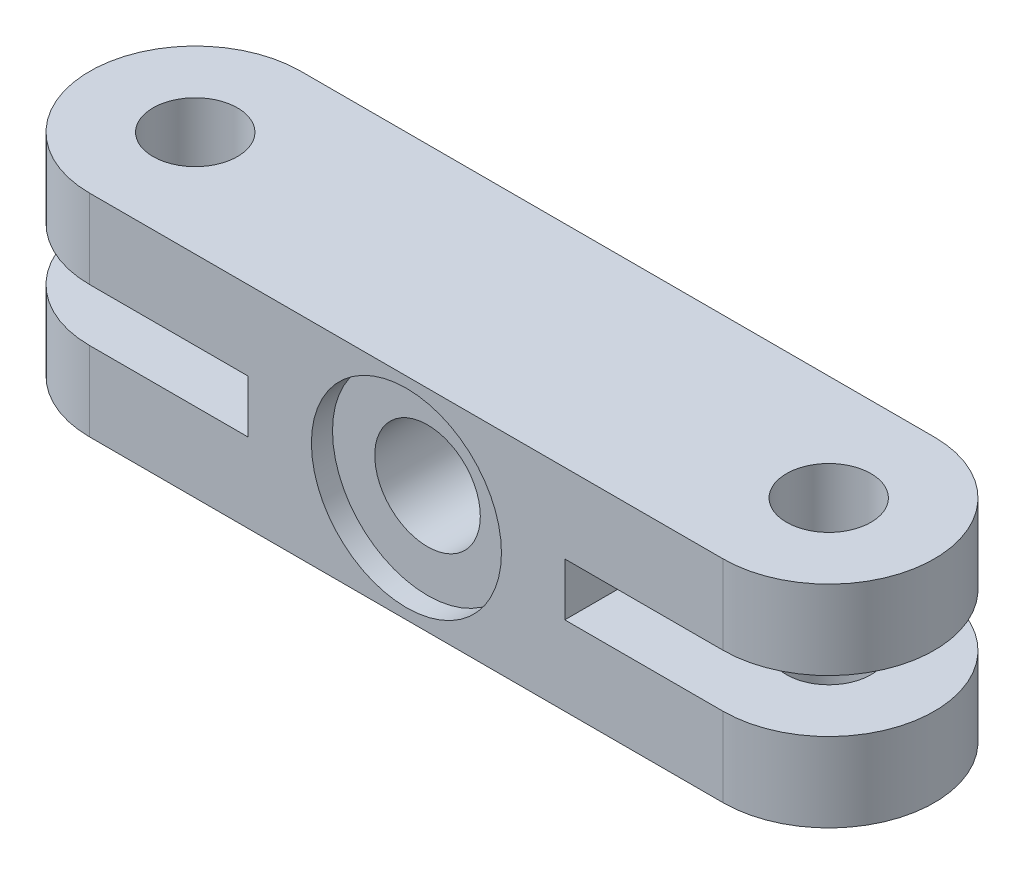
ISO-10303-21;
HEADER;
FILE_DESCRIPTION(('STEP AP214'),'2;1');
FILE_NAME('part.step','',(''),(''),'','','');
FILE_SCHEMA(('AUTOMOTIVE_DESIGN { 1 0 10303 214 1 1 1 1 }'));
ENDSEC;
DATA;
#1=APPLICATION_CONTEXT('core data for automotive mechanical design processes');
#2=APPLICATION_PROTOCOL_DEFINITION('international standard','automotive_design',2000,#1);
#3=PRODUCT_CONTEXT('',#1,'mechanical');
#4=PRODUCT('Part','Part','',(#3));
#5=PRODUCT_RELATED_PRODUCT_CATEGORY('part','',(#4));
#6=PRODUCT_DEFINITION_FORMATION('','',#4);
#7=PRODUCT_DEFINITION_CONTEXT('part definition',#1,'design');
#8=PRODUCT_DEFINITION('design','',#6,#7);
#9=PRODUCT_DEFINITION_SHAPE('','',#8);
#10=(LENGTH_UNIT() NAMED_UNIT(*) SI_UNIT(.MILLI.,.METRE.));
#11=(NAMED_UNIT(*) PLANE_ANGLE_UNIT() SI_UNIT($,.RADIAN.));
#12=(NAMED_UNIT(*) SI_UNIT($,.STERADIAN.) SOLID_ANGLE_UNIT());
#13=UNCERTAINTY_MEASURE_WITH_UNIT(LENGTH_MEASURE(1.E-05),#10,'distance_accuracy_value','');
#14=(GEOMETRIC_REPRESENTATION_CONTEXT(3) GLOBAL_UNCERTAINTY_ASSIGNED_CONTEXT((#13)) GLOBAL_UNIT_ASSIGNED_CONTEXT((#10,
#11,#12)) REPRESENTATION_CONTEXT('',''));
#15=CARTESIAN_POINT('',(0.,0.,0.));
#16=DIRECTION('',(0.,0.,1.));
#17=DIRECTION('',(1.,0.,0.));
#18=AXIS2_PLACEMENT_3D('',#15,#16,#17);
#19=CARTESIAN_POINT('',(-30.,10.,0.));
#20=DIRECTION('',(0.,-1.,0.));
#21=DIRECTION('',(0.,0.,-1.));
#22=AXIS2_PLACEMENT_3D('',#19,#20,#21);
#23=CYLINDRICAL_SURFACE('',#22,10.);
#24=DIRECTION('',(0.,-1.,0.));
#25=VECTOR('',#24,1.);
#26=CARTESIAN_POINT('',(-30.,10.,10.));
#27=LINE('',#26,#25);
#28=CARTESIAN_POINT('',(-30.,-2.5,9.99999999999999));
#29=VERTEX_POINT('',#28);
#30=CARTESIAN_POINT('',(-30.,-10.,10.));
#31=VERTEX_POINT('',#30);
#32=EDGE_CURVE('E45',#29,#31,#27,.T.);
#33=ORIENTED_EDGE('',*,*,#32,.F.);
#34=CARTESIAN_POINT('',(-30.,-2.5,0.));
#35=DIRECTION('',(0.,-1.,0.));
#36=DIRECTION('',(1.,0.,0.));
#37=AXIS2_PLACEMENT_3D('',#34,#35,#36);
#38=CIRCLE('',#37,10.);
#39=CARTESIAN_POINT('',(-30.,-2.5,-10.));
#40=VERTEX_POINT('',#39);
#41=EDGE_CURVE('E187',#29,#40,#38,.T.);
#42=ORIENTED_EDGE('',*,*,#41,.T.);
#43=DIRECTION('',(0.,-1.,0.));
#44=VECTOR('',#43,1.);
#45=CARTESIAN_POINT('',(-30.,10.,-10.));
#46=LINE('',#45,#44);
#47=CARTESIAN_POINT('',(-30.,-10.,-10.));
#48=VERTEX_POINT('',#47);
#49=EDGE_CURVE('E212',#40,#48,#46,.T.);
#50=ORIENTED_EDGE('',*,*,#49,.T.);
#51=CARTESIAN_POINT('',(-30.,-10.,0.));
#52=DIRECTION('',(0.,1.,0.));
#53=DIRECTION('',(0.,0.,1.));
#54=AXIS2_PLACEMENT_3D('',#51,#52,#53);
#55=CIRCLE('',#54,10.);
#56=EDGE_CURVE('E199',#48,#31,#55,.T.);
#57=ORIENTED_EDGE('',*,*,#56,.T.);
#58=EDGE_LOOP('',(#33,#42,#50,#57));
#59=FACE_BOUND('',#58,.T.);
#60=ADVANCED_FACE('F36',(#59),#23,.T.);
#61=CARTESIAN_POINT('',(30.,10.,0.));
#62=DIRECTION('',(0.,-1.,0.));
#63=DIRECTION('',(0.,0.,-1.));
#64=AXIS2_PLACEMENT_3D('',#61,#62,#63);
#65=CYLINDRICAL_SURFACE('',#64,10.);
#66=DIRECTION('',(0.,-1.,0.));
#67=VECTOR('',#66,1.);
#68=CARTESIAN_POINT('',(30.,10.,-10.));
#69=LINE('',#68,#67);
#70=CARTESIAN_POINT('',(30.,-2.5,-10.));
#71=VERTEX_POINT('',#70);
#72=CARTESIAN_POINT('',(30.,-10.,-10.));
#73=VERTEX_POINT('',#72);
#74=EDGE_CURVE('E226',#71,#73,#69,.T.);
#75=ORIENTED_EDGE('',*,*,#74,.F.);
#76=CARTESIAN_POINT('',(30.,-2.5,0.));
#77=DIRECTION('',(0.,-1.,0.));
#78=DIRECTION('',(0.,0.,-1.));
#79=AXIS2_PLACEMENT_3D('',#76,#77,#78);
#80=CIRCLE('',#79,10.);
#81=CARTESIAN_POINT('',(30.,-2.5,9.99999999999999));
#82=VERTEX_POINT('',#81);
#83=EDGE_CURVE('E141',#71,#82,#80,.T.);
#84=ORIENTED_EDGE('',*,*,#83,.T.);
#85=DIRECTION('',(0.,-1.,0.));
#86=VECTOR('',#85,1.);
#87=CARTESIAN_POINT('',(30.,10.,10.));
#88=LINE('',#87,#86);
#89=CARTESIAN_POINT('',(30.,-10.,10.));
#90=VERTEX_POINT('',#89);
#91=EDGE_CURVE('E229',#82,#90,#88,.T.);
#92=ORIENTED_EDGE('',*,*,#91,.T.);
#93=CARTESIAN_POINT('',(30.,-10.,0.));
#94=DIRECTION('',(0.,1.,0.));
#95=DIRECTION('',(0.,0.,1.));
#96=AXIS2_PLACEMENT_3D('',#93,#94,#95);
#97=CIRCLE('',#96,10.);
#98=EDGE_CURVE('E218',#90,#73,#97,.T.);
#99=ORIENTED_EDGE('',*,*,#98,.T.);
#100=EDGE_LOOP('',(#75,#84,#92,#99));
#101=FACE_BOUND('',#100,.T.);
#102=ADVANCED_FACE('F274',(#101),#65,.T.);
#103=CARTESIAN_POINT('',(-30.,10.,0.));
#104=DIRECTION('',(0.,-1.,0.));
#105=DIRECTION('',(0.,0.,-1.));
#106=AXIS2_PLACEMENT_3D('',#103,#104,#105);
#107=CYLINDRICAL_SURFACE('',#106,4.);
#108=CARTESIAN_POINT('',(-30.,-2.5,0.));
#109=DIRECTION('',(0.,-1.,0.));
#110=DIRECTION('',(1.,0.,0.));
#111=AXIS2_PLACEMENT_3D('',#108,#109,#110);
#112=CIRCLE('',#111,4.);
#113=CARTESIAN_POINT('',(-26.,-2.5,0.));
#114=VERTEX_POINT('',#113);
#115=EDGE_CURVE('E40',#114,#114,#112,.T.);
#116=ORIENTED_EDGE('',*,*,#115,.F.);
#117=EDGE_LOOP('',(#116));
#118=FACE_BOUND('',#117,.T.);
#119=CARTESIAN_POINT('',(-30.,-10.,0.));
#120=DIRECTION('',(0.,1.,0.));
#121=DIRECTION('',(0.,0.,1.));
#122=AXIS2_PLACEMENT_3D('',#119,#120,#121);
#123=CIRCLE('',#122,4.);
#124=CARTESIAN_POINT('',(-30.,-10.,4.));
#125=VERTEX_POINT('',#124);
#126=EDGE_CURVE('E193',#125,#125,#123,.T.);
#127=ORIENTED_EDGE('',*,*,#126,.F.);
#128=EDGE_LOOP('',(#127));
#129=FACE_BOUND('',#128,.T.);
#130=ADVANCED_FACE('F246',(#118,#129),#107,.F.);
#131=CARTESIAN_POINT('',(30.,10.,0.));
#132=DIRECTION('',(0.,-1.,0.));
#133=DIRECTION('',(0.,0.,-1.));
#134=AXIS2_PLACEMENT_3D('',#131,#132,#133);
#135=CYLINDRICAL_SURFACE('',#134,4.);
#136=CARTESIAN_POINT('',(30.,-2.5,0.));
#137=DIRECTION('',(0.,-1.,0.));
#138=DIRECTION('',(0.,0.,-1.));
#139=AXIS2_PLACEMENT_3D('',#136,#137,#138);
#140=CIRCLE('',#139,4.);
#141=CARTESIAN_POINT('',(30.,-2.5,-4.));
#142=VERTEX_POINT('',#141);
#143=EDGE_CURVE('E183',#142,#142,#140,.T.);
#144=ORIENTED_EDGE('',*,*,#143,.F.);
#145=EDGE_LOOP('',(#144));
#146=FACE_BOUND('',#145,.T.);
#147=CARTESIAN_POINT('',(30.,-10.,0.));
#148=DIRECTION('',(0.,1.,0.));
#149=DIRECTION('',(0.,0.,1.));
#150=AXIS2_PLACEMENT_3D('',#147,#148,#149);
#151=CIRCLE('',#150,4.);
#152=CARTESIAN_POINT('',(30.,-10.,4.));
#153=VERTEX_POINT('',#152);
#154=EDGE_CURVE('E189',#153,#153,#151,.T.);
#155=ORIENTED_EDGE('',*,*,#154,.F.);
#156=EDGE_LOOP('',(#155));
#157=FACE_BOUND('',#156,.T.);
#158=ADVANCED_FACE('F253',(#146,#157),#135,.F.);
#159=CARTESIAN_POINT('',(-30.,10.,0.));
#160=DIRECTION('',(0.,1.,0.));
#161=DIRECTION('',(0.,0.,1.));
#162=AXIS2_PLACEMENT_3D('',#159,#160,#161);
#163=PLANE('',#162);
#164=CARTESIAN_POINT('',(-30.,10.,0.));
#165=DIRECTION('',(0.,1.,0.));
#166=DIRECTION('',(0.,0.,1.));
#167=AXIS2_PLACEMENT_3D('',#164,#165,#166);
#168=CIRCLE('',#167,4.);
#169=CARTESIAN_POINT('',(-30.,10.,4.));
#170=VERTEX_POINT('',#169);
#171=EDGE_CURVE('E196',#170,#170,#168,.T.);
#172=ORIENTED_EDGE('',*,*,#171,.F.);
#173=EDGE_LOOP('',(#172));
#174=FACE_BOUND('',#173,.T.);
#175=CARTESIAN_POINT('',(-30.,10.,0.));
#176=DIRECTION('',(0.,1.,0.));
#177=DIRECTION('',(0.,0.,1.));
#178=AXIS2_PLACEMENT_3D('',#175,#176,#177);
#179=CIRCLE('',#178,10.);
#180=CARTESIAN_POINT('',(-30.,10.,-10.));
#181=VERTEX_POINT('',#180);
#182=CARTESIAN_POINT('',(-30.,10.,10.));
#183=VERTEX_POINT('',#182);
#184=EDGE_CURVE('E202',#181,#183,#179,.T.);
#185=ORIENTED_EDGE('',*,*,#184,.T.);
#186=DIRECTION('',(1.,0.,0.));
#187=VECTOR('',#186,1.);
#188=CARTESIAN_POINT('',(-30.,10.,10.));
#189=LINE('',#188,#187);
#190=CARTESIAN_POINT('',(30.,10.,10.));
#191=VERTEX_POINT('',#190);
#192=EDGE_CURVE('E205',#183,#191,#189,.T.);
#193=ORIENTED_EDGE('',*,*,#192,.T.);
#194=CARTESIAN_POINT('',(30.,10.,0.));
#195=DIRECTION('',(0.,1.,0.));
#196=DIRECTION('',(0.,0.,1.));
#197=AXIS2_PLACEMENT_3D('',#194,#195,#196);
#198=CIRCLE('',#197,10.);
#199=CARTESIAN_POINT('',(30.,10.,-10.));
#200=VERTEX_POINT('',#199);
#201=EDGE_CURVE('E208',#191,#200,#198,.T.);
#202=ORIENTED_EDGE('',*,*,#201,.T.);
#203=DIRECTION('',(-1.,0.,0.));
#204=VECTOR('',#203,1.);
#205=CARTESIAN_POINT('',(-30.,10.,-10.));
#206=LINE('',#205,#204);
#207=EDGE_CURVE('E210',#200,#181,#206,.T.);
#208=ORIENTED_EDGE('',*,*,#207,.T.);
#209=EDGE_LOOP('',(#185,#193,#202,#208));
#210=FACE_BOUND('',#209,.T.);
#211=CARTESIAN_POINT('',(30.,10.,0.));
#212=DIRECTION('',(0.,1.,0.));
#213=DIRECTION('',(0.,0.,1.));
#214=AXIS2_PLACEMENT_3D('',#211,#212,#213);
#215=CIRCLE('',#214,4.);
#216=CARTESIAN_POINT('',(30.,10.,4.));
#217=VERTEX_POINT('',#216);
#218=EDGE_CURVE('E190',#217,#217,#215,.T.);
#219=ORIENTED_EDGE('',*,*,#218,.F.);
#220=EDGE_LOOP('',(#219));
#221=FACE_BOUND('',#220,.T.);
#222=ADVANCED_FACE('F249',(#174,#210,#221),#163,.T.);
#223=CARTESIAN_POINT('',(-30.,-10.,0.));
#224=DIRECTION('',(0.,1.,0.));
#225=DIRECTION('',(0.,0.,1.));
#226=AXIS2_PLACEMENT_3D('',#223,#224,#225);
#227=PLANE('',#226);
#228=ORIENTED_EDGE('',*,*,#56,.F.);
#229=DIRECTION('',(-1.,0.,0.));
#230=VECTOR('',#229,1.);
#231=CARTESIAN_POINT('',(-30.,-10.,-10.));
#232=LINE('',#231,#230);
#233=EDGE_CURVE('E206',#73,#48,#232,.T.);
#234=ORIENTED_EDGE('',*,*,#233,.F.);
#235=ORIENTED_EDGE('',*,*,#98,.F.);
#236=DIRECTION('',(1.,0.,0.));
#237=VECTOR('',#236,1.);
#238=CARTESIAN_POINT('',(-30.,-10.,10.));
#239=LINE('',#238,#237);
#240=EDGE_CURVE('E215',#31,#90,#239,.T.);
#241=ORIENTED_EDGE('',*,*,#240,.F.);
#242=EDGE_LOOP('',(#228,#234,#235,#241));
#243=FACE_BOUND('',#242,.T.);
#244=ORIENTED_EDGE('',*,*,#126,.T.);
#245=EDGE_LOOP('',(#244));
#246=FACE_BOUND('',#245,.T.);
#247=ORIENTED_EDGE('',*,*,#154,.T.);
#248=EDGE_LOOP('',(#247));
#249=FACE_BOUND('',#248,.T.);
#250=ADVANCED_FACE('F252',(#243,#246,#249),#227,.F.);
#251=CARTESIAN_POINT('',(-30.,2.5,0.));
#252=DIRECTION('',(0.,1.,0.));
#253=DIRECTION('',(-1.,0.,0.));
#254=AXIS2_PLACEMENT_3D('',#251,#252,#253);
#255=CIRCLE('',#254,10.);
#256=CARTESIAN_POINT('',(-30.,2.5,-10.));
#257=VERTEX_POINT('',#256);
#258=CARTESIAN_POINT('',(-30.,2.5,9.99999999999999));
#259=VERTEX_POINT('',#258);
#260=EDGE_CURVE('E61',#257,#259,#255,.T.);
#261=ORIENTED_EDGE('',*,*,#260,.T.);
#262=EDGE_CURVE('E11',#183,#259,#27,.T.);
#263=ORIENTED_EDGE('',*,*,#262,.F.);
#264=ORIENTED_EDGE('',*,*,#184,.F.);
#265=EDGE_CURVE('E223',#181,#257,#46,.T.);
#266=ORIENTED_EDGE('',*,*,#265,.T.);
#267=EDGE_LOOP('',(#261,#263,#264,#266));
#268=FACE_BOUND('',#267,.T.);
#269=ADVANCED_FACE('F38',(#268),#23,.T.);
#270=CARTESIAN_POINT('',(-30.,10.,10.));
#271=DIRECTION('',(0.,0.,-1.));
#272=DIRECTION('',(-1.,0.,0.));
#273=AXIS2_PLACEMENT_3D('',#270,#271,#272);
#274=PLANE('',#273);
#275=CARTESIAN_POINT('',(0.,0.,9.99999999999999));
#276=DIRECTION('',(0.,0.,1.));
#277=DIRECTION('',(1.,0.,0.));
#278=AXIS2_PLACEMENT_3D('',#275,#276,#277);
#279=CIRCLE('',#278,9.00000000000001);
#280=CARTESIAN_POINT('',(9.00000000000001,0.,9.99999999999999));
#281=VERTEX_POINT('',#280);
#282=EDGE_CURVE('E357',#281,#281,#279,.T.);
#283=ORIENTED_EDGE('',*,*,#282,.F.);
#284=EDGE_LOOP('',(#283));
#285=FACE_BOUND('',#284,.T.);
#286=ORIENTED_EDGE('',*,*,#91,.F.);
#287=DIRECTION('',(1.,0.,0.));
#288=VECTOR('',#287,1.);
#289=CARTESIAN_POINT('',(15.,-2.5,9.99999999999999));
#290=LINE('',#289,#288);
#291=CARTESIAN_POINT('',(15.,-2.5,9.99999999999999));
#292=VERTEX_POINT('',#291);
#293=EDGE_CURVE('E151',#292,#82,#290,.T.);
#294=ORIENTED_EDGE('',*,*,#293,.F.);
#295=DIRECTION('',(0.,-1.,0.));
#296=VECTOR('',#295,1.);
#297=CARTESIAN_POINT('',(15.,2.5,9.99999999999999));
#298=LINE('',#297,#296);
#299=CARTESIAN_POINT('',(15.,2.5,9.99999999999999));
#300=VERTEX_POINT('',#299);
#301=EDGE_CURVE('E131',#300,#292,#298,.T.);
#302=ORIENTED_EDGE('',*,*,#301,.F.);
#303=DIRECTION('',(-1.,0.,0.));
#304=VECTOR('',#303,1.);
#305=CARTESIAN_POINT('',(15.,2.5,9.99999999999999));
#306=LINE('',#305,#304);
#307=CARTESIAN_POINT('',(30.,2.5,9.99999999999999));
#308=VERTEX_POINT('',#307);
#309=EDGE_CURVE('E155',#308,#300,#306,.T.);
#310=ORIENTED_EDGE('',*,*,#309,.F.);
#311=EDGE_CURVE('E230',#191,#308,#88,.T.);
#312=ORIENTED_EDGE('',*,*,#311,.F.);
#313=ORIENTED_EDGE('',*,*,#192,.F.);
#314=ORIENTED_EDGE('',*,*,#262,.T.);
#315=DIRECTION('',(-1.,0.,0.));
#316=VECTOR('',#315,1.);
#317=CARTESIAN_POINT('',(-15.,2.5,9.99999999999999));
#318=LINE('',#317,#316);
#319=CARTESIAN_POINT('',(-15.,2.5,9.99999999999999));
#320=VERTEX_POINT('',#319);
#321=EDGE_CURVE('E174',#320,#259,#318,.T.);
#322=ORIENTED_EDGE('',*,*,#321,.F.);
#323=DIRECTION('',(0.,1.,0.));
#324=VECTOR('',#323,1.);
#325=CARTESIAN_POINT('',(-15.,2.5,9.99999999999999));
#326=LINE('',#325,#324);
#327=CARTESIAN_POINT('',(-15.,-2.5,9.99999999999999));
#328=VERTEX_POINT('',#327);
#329=EDGE_CURVE('E171',#328,#320,#326,.T.);
#330=ORIENTED_EDGE('',*,*,#329,.F.);
#331=DIRECTION('',(1.,0.,0.));
#332=VECTOR('',#331,1.);
#333=CARTESIAN_POINT('',(-15.,-2.5,9.99999999999999));
#334=LINE('',#333,#332);
#335=EDGE_CURVE('E165',#29,#328,#334,.T.);
#336=ORIENTED_EDGE('',*,*,#335,.F.);
#337=ORIENTED_EDGE('',*,*,#32,.T.);
#338=ORIENTED_EDGE('',*,*,#240,.T.);
#339=EDGE_LOOP('',(#286,#294,#302,#310,#312,#313,#314,#322,#330,#336,#337,#338));
#340=FACE_BOUND('',#339,.T.);
#341=ADVANCED_FACE('F284',(#285,#340),#274,.F.);
#342=ORIENTED_EDGE('',*,*,#311,.T.);
#343=CARTESIAN_POINT('',(30.,2.5,0.));
#344=DIRECTION('',(0.,1.,0.));
#345=DIRECTION('',(0.,0.,1.));
#346=AXIS2_PLACEMENT_3D('',#343,#344,#345);
#347=CIRCLE('',#346,10.);
#348=CARTESIAN_POINT('',(30.,2.5,-10.));
#349=VERTEX_POINT('',#348);
#350=EDGE_CURVE('E181',#308,#349,#347,.T.);
#351=ORIENTED_EDGE('',*,*,#350,.T.);
#352=EDGE_CURVE('E227',#200,#349,#69,.T.);
#353=ORIENTED_EDGE('',*,*,#352,.F.);
#354=ORIENTED_EDGE('',*,*,#201,.F.);
#355=EDGE_LOOP('',(#342,#351,#353,#354));
#356=FACE_BOUND('',#355,.T.);
#357=ADVANCED_FACE('F281',(#356),#65,.T.);
#358=CARTESIAN_POINT('',(-30.,10.,-10.));
#359=DIRECTION('',(0.,0.,1.));
#360=DIRECTION('',(1.,0.,0.));
#361=AXIS2_PLACEMENT_3D('',#358,#359,#360);
#362=PLANE('',#361);
#363=CARTESIAN_POINT('',(0.,0.,-10.));
#364=DIRECTION('',(0.,0.,1.));
#365=DIRECTION('',(1.,0.,0.));
#366=AXIS2_PLACEMENT_3D('',#363,#364,#365);
#367=CIRCLE('',#366,5.00000000000001);
#368=CARTESIAN_POINT('',(5.00000000000001,0.,-10.));
#369=VERTEX_POINT('',#368);
#370=EDGE_CURVE('E175',#369,#369,#367,.T.);
#371=ORIENTED_EDGE('',*,*,#370,.T.);
#372=EDGE_LOOP('',(#371));
#373=FACE_BOUND('',#372,.T.);
#374=DIRECTION('',(0.,-1.,0.));
#375=VECTOR('',#374,1.);
#376=CARTESIAN_POINT('',(15.,2.5,-10.));
#377=LINE('',#376,#375);
#378=CARTESIAN_POINT('',(15.,2.5,-10.));
#379=VERTEX_POINT('',#378);
#380=CARTESIAN_POINT('',(15.,-2.5,-10.));
#381=VERTEX_POINT('',#380);
#382=EDGE_CURVE('E53',#379,#381,#377,.T.);
#383=ORIENTED_EDGE('',*,*,#382,.T.);
#384=DIRECTION('',(1.,0.,0.));
#385=VECTOR('',#384,1.);
#386=CARTESIAN_POINT('',(15.,-2.5,-10.));
#387=LINE('',#386,#385);
#388=EDGE_CURVE('E139',#381,#71,#387,.T.);
#389=ORIENTED_EDGE('',*,*,#388,.T.);
#390=ORIENTED_EDGE('',*,*,#74,.T.);
#391=ORIENTED_EDGE('',*,*,#233,.T.);
#392=ORIENTED_EDGE('',*,*,#49,.F.);
#393=DIRECTION('',(1.,0.,0.));
#394=VECTOR('',#393,1.);
#395=CARTESIAN_POINT('',(-15.,-2.5,-10.));
#396=LINE('',#395,#394);
#397=CARTESIAN_POINT('',(-15.,-2.5,-10.));
#398=VERTEX_POINT('',#397);
#399=EDGE_CURVE('E167',#40,#398,#396,.T.);
#400=ORIENTED_EDGE('',*,*,#399,.T.);
#401=DIRECTION('',(0.,1.,0.));
#402=VECTOR('',#401,1.);
#403=CARTESIAN_POINT('',(-15.,2.5,-10.));
#404=LINE('',#403,#402);
#405=CARTESIAN_POINT('',(-15.,2.5,-10.));
#406=VERTEX_POINT('',#405);
#407=EDGE_CURVE('E161',#398,#406,#404,.T.);
#408=ORIENTED_EDGE('',*,*,#407,.T.);
#409=DIRECTION('',(-1.,0.,0.));
#410=VECTOR('',#409,1.);
#411=CARTESIAN_POINT('',(-15.,2.5,-10.));
#412=LINE('',#411,#410);
#413=EDGE_CURVE('E164',#406,#257,#412,.T.);
#414=ORIENTED_EDGE('',*,*,#413,.T.);
#415=ORIENTED_EDGE('',*,*,#265,.F.);
#416=ORIENTED_EDGE('',*,*,#207,.F.);
#417=ORIENTED_EDGE('',*,*,#352,.T.);
#418=DIRECTION('',(-1.,0.,0.));
#419=VECTOR('',#418,1.);
#420=CARTESIAN_POINT('',(15.,2.5,-10.));
#421=LINE('',#420,#419);
#422=EDGE_CURVE('E149',#349,#379,#421,.T.);
#423=ORIENTED_EDGE('',*,*,#422,.T.);
#424=EDGE_LOOP('',(#383,#389,#390,#391,#392,#400,#408,#414,#415,#416,#417,#423));
#425=FACE_BOUND('',#424,.T.);
#426=ADVANCED_FACE('F146',(#373,#425),#362,.F.);
#427=CARTESIAN_POINT('',(-30.,2.5,0.));
#428=DIRECTION('',(0.,1.,0.));
#429=DIRECTION('',(-1.,0.,0.));
#430=AXIS2_PLACEMENT_3D('',#427,#428,#429);
#431=CIRCLE('',#430,4.);
#432=CARTESIAN_POINT('',(-34.,2.5,0.));
#433=VERTEX_POINT('',#432);
#434=EDGE_CURVE('E185',#433,#433,#431,.T.);
#435=ORIENTED_EDGE('',*,*,#434,.F.);
#436=EDGE_LOOP('',(#435));
#437=FACE_BOUND('',#436,.T.);
#438=ORIENTED_EDGE('',*,*,#171,.T.);
#439=EDGE_LOOP('',(#438));
#440=FACE_BOUND('',#439,.T.);
#441=ADVANCED_FACE('F241',(#437,#440),#107,.F.);
#442=CARTESIAN_POINT('',(30.,2.5,0.));
#443=DIRECTION('',(0.,1.,0.));
#444=DIRECTION('',(0.,0.,1.));
#445=AXIS2_PLACEMENT_3D('',#442,#443,#444);
#446=CIRCLE('',#445,4.);
#447=CARTESIAN_POINT('',(30.,2.5,4.));
#448=VERTEX_POINT('',#447);
#449=EDGE_CURVE('E135',#448,#448,#446,.T.);
#450=ORIENTED_EDGE('',*,*,#449,.F.);
#451=EDGE_LOOP('',(#450));
#452=FACE_BOUND('',#451,.T.);
#453=ORIENTED_EDGE('',*,*,#218,.T.);
#454=EDGE_LOOP('',(#453));
#455=FACE_BOUND('',#454,.T.);
#456=ADVANCED_FACE('F244',(#452,#455),#135,.F.);
#457=CARTESIAN_POINT('',(15.,-2.5,-10.));
#458=DIRECTION('',(0.,-1.,0.));
#459=DIRECTION('',(0.,0.,-1.));
#460=AXIS2_PLACEMENT_3D('',#457,#458,#459);
#461=PLANE('',#460);
#462=ORIENTED_EDGE('',*,*,#143,.T.);
#463=EDGE_LOOP('',(#462));
#464=FACE_BOUND('',#463,.T.);
#465=ORIENTED_EDGE('',*,*,#388,.F.);
#466=DIRECTION('',(0.,0.,1.));
#467=VECTOR('',#466,1.);
#468=CARTESIAN_POINT('',(15.,-2.5,-10.));
#469=LINE('',#468,#467);
#470=EDGE_CURVE('E127',#381,#292,#469,.T.);
#471=ORIENTED_EDGE('',*,*,#470,.T.);
#472=ORIENTED_EDGE('',*,*,#293,.T.);
#473=ORIENTED_EDGE('',*,*,#83,.F.);
#474=EDGE_LOOP('',(#465,#471,#472,#473));
#475=FACE_BOUND('',#474,.T.);
#476=ADVANCED_FACE('F140',(#464,#475),#461,.F.);
#477=CARTESIAN_POINT('',(15.,2.5,-10.));
#478=DIRECTION('',(0.,1.,0.));
#479=DIRECTION('',(0.,0.,1.));
#480=AXIS2_PLACEMENT_3D('',#477,#478,#479);
#481=PLANE('',#480);
#482=ORIENTED_EDGE('',*,*,#449,.T.);
#483=EDGE_LOOP('',(#482));
#484=FACE_BOUND('',#483,.T.);
#485=ORIENTED_EDGE('',*,*,#309,.T.);
#486=DIRECTION('',(0.,0.,1.));
#487=VECTOR('',#486,1.);
#488=CARTESIAN_POINT('',(15.,2.5,-10.));
#489=LINE('',#488,#487);
#490=EDGE_CURVE('E136',#379,#300,#489,.T.);
#491=ORIENTED_EDGE('',*,*,#490,.F.);
#492=ORIENTED_EDGE('',*,*,#422,.F.);
#493=ORIENTED_EDGE('',*,*,#350,.F.);
#494=EDGE_LOOP('',(#485,#491,#492,#493));
#495=FACE_BOUND('',#494,.T.);
#496=ADVANCED_FACE('F266',(#484,#495),#481,.F.);
#497=CARTESIAN_POINT('',(15.,2.5,-10.));
#498=DIRECTION('',(-1.,0.,0.));
#499=DIRECTION('',(0.,0.,1.));
#500=AXIS2_PLACEMENT_3D('',#497,#498,#499);
#501=PLANE('',#500);
#502=ORIENTED_EDGE('',*,*,#301,.T.);
#503=ORIENTED_EDGE('',*,*,#470,.F.);
#504=ORIENTED_EDGE('',*,*,#382,.F.);
#505=ORIENTED_EDGE('',*,*,#490,.T.);
#506=EDGE_LOOP('',(#502,#503,#504,#505));
#507=FACE_BOUND('',#506,.T.);
#508=ADVANCED_FACE('F129',(#507),#501,.F.);
#509=CARTESIAN_POINT('',(-15.,-2.5,-10.));
#510=DIRECTION('',(0.,-1.,0.));
#511=DIRECTION('',(1.,0.,0.));
#512=AXIS2_PLACEMENT_3D('',#509,#510,#511);
#513=PLANE('',#512);
#514=ORIENTED_EDGE('',*,*,#115,.T.);
#515=EDGE_LOOP('',(#514));
#516=FACE_BOUND('',#515,.T.);
#517=ORIENTED_EDGE('',*,*,#335,.T.);
#518=DIRECTION('',(0.,0.,1.));
#519=VECTOR('',#518,1.);
#520=CARTESIAN_POINT('',(-15.,-2.5,-10.));
#521=LINE('',#520,#519);
#522=EDGE_CURVE('E157',#398,#328,#521,.T.);
#523=ORIENTED_EDGE('',*,*,#522,.F.);
#524=ORIENTED_EDGE('',*,*,#399,.F.);
#525=ORIENTED_EDGE('',*,*,#41,.F.);
#526=EDGE_LOOP('',(#517,#523,#524,#525));
#527=FACE_BOUND('',#526,.T.);
#528=ADVANCED_FACE('F323',(#516,#527),#513,.F.);
#529=CARTESIAN_POINT('',(-15.,2.5,-10.));
#530=DIRECTION('',(0.,1.,0.));
#531=DIRECTION('',(-1.,0.,0.));
#532=AXIS2_PLACEMENT_3D('',#529,#530,#531);
#533=PLANE('',#532);
#534=ORIENTED_EDGE('',*,*,#434,.T.);
#535=EDGE_LOOP('',(#534));
#536=FACE_BOUND('',#535,.T.);
#537=ORIENTED_EDGE('',*,*,#260,.F.);
#538=ORIENTED_EDGE('',*,*,#413,.F.);
#539=DIRECTION('',(0.,0.,1.));
#540=VECTOR('',#539,1.);
#541=CARTESIAN_POINT('',(-15.,2.5,-10.));
#542=LINE('',#541,#540);
#543=EDGE_CURVE('E170',#406,#320,#542,.T.);
#544=ORIENTED_EDGE('',*,*,#543,.T.);
#545=ORIENTED_EDGE('',*,*,#321,.T.);
#546=EDGE_LOOP('',(#537,#538,#544,#545));
#547=FACE_BOUND('',#546,.T.);
#548=ADVANCED_FACE('F239',(#536,#547),#533,.F.);
#549=CARTESIAN_POINT('',(-15.,2.5,-10.));
#550=DIRECTION('',(1.,0.,0.));
#551=DIRECTION('',(0.,1.,0.));
#552=AXIS2_PLACEMENT_3D('',#549,#550,#551);
#553=PLANE('',#552);
#554=ORIENTED_EDGE('',*,*,#329,.T.);
#555=ORIENTED_EDGE('',*,*,#543,.F.);
#556=ORIENTED_EDGE('',*,*,#407,.F.);
#557=ORIENTED_EDGE('',*,*,#522,.T.);
#558=EDGE_LOOP('',(#554,#555,#556,#557));
#559=FACE_BOUND('',#558,.T.);
#560=ADVANCED_FACE('F308',(#559),#553,.F.);
#561=CARTESIAN_POINT('',(0.,0.,9.99999999999999));
#562=DIRECTION('',(0.,0.,1.));
#563=DIRECTION('',(1.,0.,0.));
#564=AXIS2_PLACEMENT_3D('',#561,#562,#563);
#565=CYLINDRICAL_SURFACE('',#564,5.00000000000001);
#566=ORIENTED_EDGE('',*,*,#370,.F.);
#567=EDGE_LOOP('',(#566));
#568=FACE_BOUND('',#567,.T.);
#569=CARTESIAN_POINT('',(0.,0.,7.99999999999999));
#570=DIRECTION('',(0.,0.,1.));
#571=DIRECTION('',(1.,0.,0.));
#572=AXIS2_PLACEMENT_3D('',#569,#570,#571);
#573=CIRCLE('',#572,5.00000000000001);
#574=CARTESIAN_POINT('',(5.00000000000001,0.,7.99999999999999));
#575=VERTEX_POINT('',#574);
#576=EDGE_CURVE('E359',#575,#575,#573,.T.);
#577=ORIENTED_EDGE('',*,*,#576,.T.);
#578=EDGE_LOOP('',(#577));
#579=FACE_BOUND('',#578,.T.);
#580=ADVANCED_FACE('F331',(#568,#579),#565,.F.);
#581=CARTESIAN_POINT('',(5.00000000000001,0.,7.99999999999999));
#582=DIRECTION('',(0.,0.,-1.));
#583=DIRECTION('',(-1.,0.,0.));
#584=AXIS2_PLACEMENT_3D('',#581,#582,#583);
#585=PLANE('',#584);
#586=ORIENTED_EDGE('',*,*,#576,.F.);
#587=EDGE_LOOP('',(#586));
#588=FACE_BOUND('',#587,.T.);
#589=CARTESIAN_POINT('',(0.,0.,7.99999999999999));
#590=DIRECTION('',(0.,0.,1.));
#591=DIRECTION('',(1.,0.,0.));
#592=AXIS2_PLACEMENT_3D('',#589,#590,#591);
#593=CIRCLE('',#592,9.00000000000001);
#594=CARTESIAN_POINT('',(9.00000000000001,0.,7.99999999999999));
#595=VERTEX_POINT('',#594);
#596=EDGE_CURVE('E354',#595,#595,#593,.T.);
#597=ORIENTED_EDGE('',*,*,#596,.T.);
#598=EDGE_LOOP('',(#597));
#599=FACE_BOUND('',#598,.T.);
#600=ADVANCED_FACE('F335',(#588,#599),#585,.F.);
#601=CARTESIAN_POINT('',(0.,0.,9.99999999999999));
#602=DIRECTION('',(0.,0.,1.));
#603=DIRECTION('',(1.,0.,0.));
#604=AXIS2_PLACEMENT_3D('',#601,#602,#603);
#605=CYLINDRICAL_SURFACE('',#604,9.00000000000001);
#606=ORIENTED_EDGE('',*,*,#596,.F.);
#607=EDGE_LOOP('',(#606));
#608=FACE_BOUND('',#607,.T.);
#609=ORIENTED_EDGE('',*,*,#282,.T.);
#610=EDGE_LOOP('',(#609));
#611=FACE_BOUND('',#610,.T.);
#612=ADVANCED_FACE('F341',(#608,#611),#605,.F.);
#613=CLOSED_SHELL('',(#60,#102,#130,#158,#222,#250,#269,#341,#357,#426,#441,#456,#476,#496,#508,
#528,#548,#560,#580,#600,#612));
#614=MANIFOLD_SOLID_BREP('B2',#613);
#615=ADVANCED_BREP_SHAPE_REPRESENTATION('',(#18,#614),#14);
#616=SHAPE_DEFINITION_REPRESENTATION(#9,#615);
ENDSEC;
END-ISO-10303-21;
